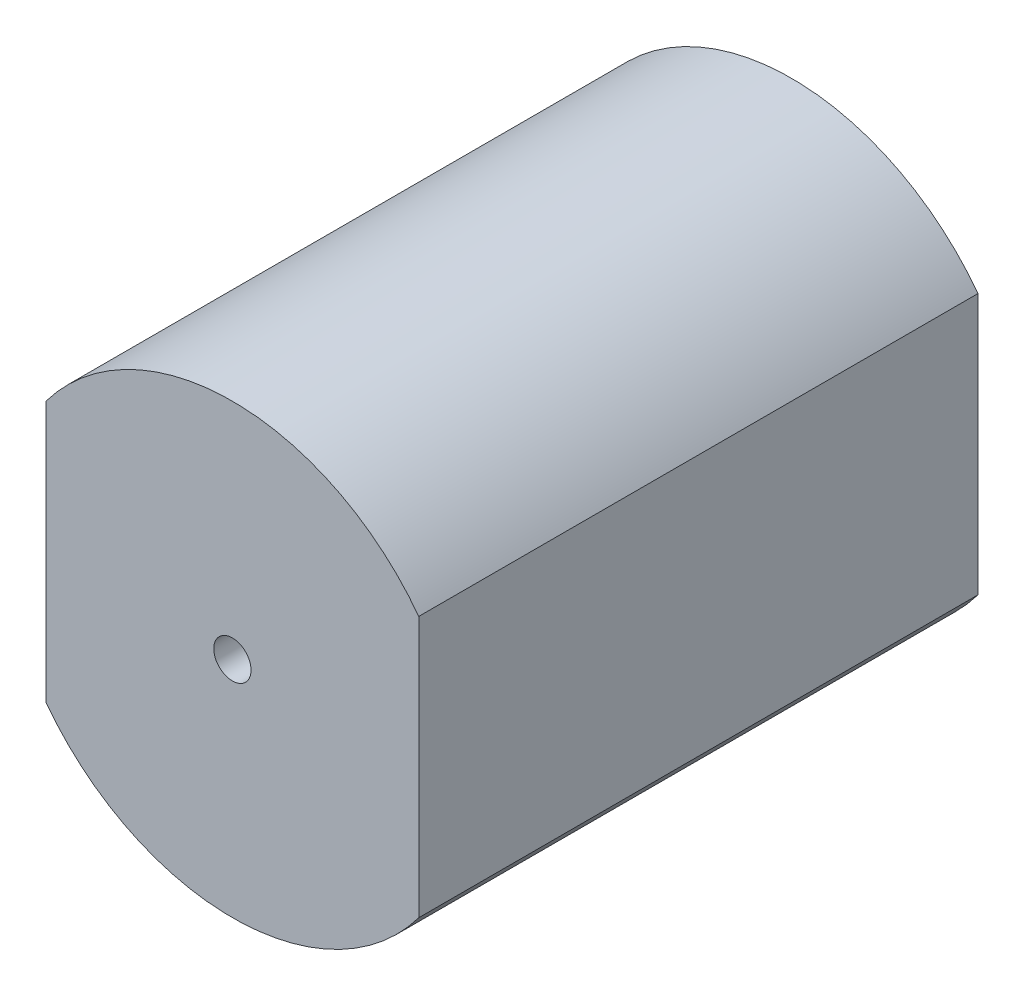
ISO-10303-21;
HEADER;
FILE_DESCRIPTION(('STEP AP214'),'2;1');
FILE_NAME('part.step','',(''),(''),'','','');
FILE_SCHEMA(('AUTOMOTIVE_DESIGN { 1 0 10303 214 1 1 1 1 }'));
ENDSEC;
DATA;
#1=APPLICATION_CONTEXT('core data for automotive mechanical design processes');
#2=APPLICATION_PROTOCOL_DEFINITION('international standard','automotive_design',2000,#1);
#3=PRODUCT_CONTEXT('',#1,'mechanical');
#4=PRODUCT('Part','Part','',(#3));
#5=PRODUCT_RELATED_PRODUCT_CATEGORY('part','',(#4));
#6=PRODUCT_DEFINITION_FORMATION('','',#4);
#7=PRODUCT_DEFINITION_CONTEXT('part definition',#1,'design');
#8=PRODUCT_DEFINITION('design','',#6,#7);
#9=PRODUCT_DEFINITION_SHAPE('','',#8);
#10=(LENGTH_UNIT() NAMED_UNIT(*) SI_UNIT(.MILLI.,.METRE.));
#11=(NAMED_UNIT(*) PLANE_ANGLE_UNIT() SI_UNIT($,.RADIAN.));
#12=(NAMED_UNIT(*) SI_UNIT($,.STERADIAN.) SOLID_ANGLE_UNIT());
#13=UNCERTAINTY_MEASURE_WITH_UNIT(LENGTH_MEASURE(1.E-05),#10,'distance_accuracy_value','');
#14=(GEOMETRIC_REPRESENTATION_CONTEXT(3) GLOBAL_UNCERTAINTY_ASSIGNED_CONTEXT((#13)) GLOBAL_UNIT_ASSIGNED_CONTEXT((#10,
#11,#12)) REPRESENTATION_CONTEXT('',''));
#15=CARTESIAN_POINT('',(0.,0.,0.));
#16=DIRECTION('',(0.,0.,1.));
#17=DIRECTION('',(1.,0.,0.));
#18=AXIS2_PLACEMENT_3D('',#15,#16,#17);
#19=CARTESIAN_POINT('',(5.,6.25,-15.));
#20=DIRECTION('',(0.,0.,1.));
#21=DIRECTION('',(1.,0.,0.));
#22=AXIS2_PLACEMENT_3D('',#19,#20,#21);
#23=PLANE('',#22);
#24=CARTESIAN_POINT('',(5.,6.,-15.));
#25=DIRECTION('',(0.,0.,1.));
#26=DIRECTION('',(1.,0.,0.));
#27=AXIS2_PLACEMENT_3D('',#24,#25,#26);
#28=CIRCLE('',#27,2.6);
#29=CARTESIAN_POINT('',(7.6,6.,-15.));
#30=VERTEX_POINT('',#29);
#31=EDGE_CURVE('E11',#30,#30,#28,.T.);
#32=ORIENTED_EDGE('',*,*,#31,.T.);
#33=EDGE_LOOP('',(#32));
#34=FACE_BOUND('',#33,.T.);
#35=CARTESIAN_POINT('',(5.,6.25,-15.));
#36=DIRECTION('',(0.,0.,1.));
#37=DIRECTION('',(1.,0.,0.));
#38=AXIS2_PLACEMENT_3D('',#35,#36,#37);
#39=CIRCLE('',#38,6.25);
#40=CARTESIAN_POINT('',(0.,2.5,-15.));
#41=VERTEX_POINT('',#40);
#42=CARTESIAN_POINT('',(10.,2.5,-15.));
#43=VERTEX_POINT('',#42);
#44=EDGE_CURVE('E95',#41,#43,#39,.T.);
#45=ORIENTED_EDGE('',*,*,#44,.F.);
#46=DIRECTION('',(0.,-1.,0.));
#47=VECTOR('',#46,1.);
#48=CARTESIAN_POINT('',(0.,2.5,-15.));
#49=LINE('',#48,#47);
#50=CARTESIAN_POINT('',(0.,9.5,-15.));
#51=VERTEX_POINT('',#50);
#52=EDGE_CURVE('E92',#51,#41,#49,.T.);
#53=ORIENTED_EDGE('',*,*,#52,.F.);
#54=CARTESIAN_POINT('',(5.,5.75,-15.));
#55=DIRECTION('',(0.,0.,1.));
#56=DIRECTION('',(-1.,0.,0.));
#57=AXIS2_PLACEMENT_3D('',#54,#55,#56);
#58=CIRCLE('',#57,6.25);
#59=CARTESIAN_POINT('',(10.,9.5,-15.));
#60=VERTEX_POINT('',#59);
#61=EDGE_CURVE('E85',#60,#51,#58,.T.);
#62=ORIENTED_EDGE('',*,*,#61,.F.);
#63=DIRECTION('',(0.,1.,0.));
#64=VECTOR('',#63,1.);
#65=CARTESIAN_POINT('',(10.,2.5,-15.));
#66=LINE('',#65,#64);
#67=EDGE_CURVE('E91',#43,#60,#66,.T.);
#68=ORIENTED_EDGE('',*,*,#67,.F.);
#69=EDGE_LOOP('',(#45,#53,#62,#68));
#70=FACE_BOUND('',#69,.T.);
#71=ADVANCED_FACE('F34',(#34,#70),#23,.F.);
#72=CARTESIAN_POINT('',(5.,6.25,-15.));
#73=DIRECTION('',(0.,0.,1.));
#74=DIRECTION('',(1.,0.,0.));
#75=AXIS2_PLACEMENT_3D('',#72,#73,#74);
#76=CYLINDRICAL_SURFACE('',#75,6.25);
#77=CARTESIAN_POINT('',(5.,6.25,0.));
#78=DIRECTION('',(0.,0.,1.));
#79=DIRECTION('',(1.,0.,0.));
#80=AXIS2_PLACEMENT_3D('',#77,#78,#79);
#81=CIRCLE('',#80,6.25);
#82=CARTESIAN_POINT('',(0.,2.5,0.));
#83=VERTEX_POINT('',#82);
#84=CARTESIAN_POINT('',(10.,2.5,0.));
#85=VERTEX_POINT('',#84);
#86=EDGE_CURVE('E102',#83,#85,#81,.T.);
#87=ORIENTED_EDGE('',*,*,#86,.F.);
#88=DIRECTION('',(0.,0.,1.));
#89=VECTOR('',#88,1.);
#90=CARTESIAN_POINT('',(0.,2.5,-15.));
#91=LINE('',#90,#89);
#92=EDGE_CURVE('E51',#41,#83,#91,.T.);
#93=ORIENTED_EDGE('',*,*,#92,.F.);
#94=ORIENTED_EDGE('',*,*,#44,.T.);
#95=DIRECTION('',(0.,0.,1.));
#96=VECTOR('',#95,1.);
#97=CARTESIAN_POINT('',(10.,2.5,-15.));
#98=LINE('',#97,#96);
#99=EDGE_CURVE('E79',#43,#85,#98,.T.);
#100=ORIENTED_EDGE('',*,*,#99,.T.);
#101=EDGE_LOOP('',(#87,#93,#94,#100));
#102=FACE_BOUND('',#101,.T.);
#103=ADVANCED_FACE('F151',(#102),#76,.T.);
#104=CARTESIAN_POINT('',(0.,2.5,-15.));
#105=DIRECTION('',(-1.,0.,0.));
#106=DIRECTION('',(0.,0.,1.));
#107=AXIS2_PLACEMENT_3D('',#104,#105,#106);
#108=PLANE('',#107);
#109=DIRECTION('',(0.,-1.,0.));
#110=VECTOR('',#109,1.);
#111=CARTESIAN_POINT('',(0.,2.5,0.));
#112=LINE('',#111,#110);
#113=CARTESIAN_POINT('',(0.,9.5,0.));
#114=VERTEX_POINT('',#113);
#115=EDGE_CURVE('E97',#114,#83,#112,.T.);
#116=ORIENTED_EDGE('',*,*,#115,.F.);
#117=DIRECTION('',(0.,0.,1.));
#118=VECTOR('',#117,1.);
#119=CARTESIAN_POINT('',(0.,9.5,-15.));
#120=LINE('',#119,#118);
#121=EDGE_CURVE('E68',#51,#114,#120,.T.);
#122=ORIENTED_EDGE('',*,*,#121,.F.);
#123=ORIENTED_EDGE('',*,*,#52,.T.);
#124=ORIENTED_EDGE('',*,*,#92,.T.);
#125=EDGE_LOOP('',(#116,#122,#123,#124));
#126=FACE_BOUND('',#125,.T.);
#127=ADVANCED_FACE('F157',(#126),#108,.T.);
#128=CARTESIAN_POINT('',(5.,5.75,-15.));
#129=DIRECTION('',(0.,0.,1.));
#130=DIRECTION('',(1.,0.,0.));
#131=AXIS2_PLACEMENT_3D('',#128,#129,#130);
#132=CYLINDRICAL_SURFACE('',#131,6.25);
#133=CARTESIAN_POINT('',(5.,5.75,0.));
#134=DIRECTION('',(0.,0.,1.));
#135=DIRECTION('',(-1.,0.,0.));
#136=AXIS2_PLACEMENT_3D('',#133,#134,#135);
#137=CIRCLE('',#136,6.25);
#138=CARTESIAN_POINT('',(10.,9.5,0.));
#139=VERTEX_POINT('',#138);
#140=EDGE_CURVE('E87',#139,#114,#137,.T.);
#141=ORIENTED_EDGE('',*,*,#140,.F.);
#142=DIRECTION('',(0.,0.,1.));
#143=VECTOR('',#142,1.);
#144=CARTESIAN_POINT('',(10.,9.5,-15.));
#145=LINE('',#144,#143);
#146=EDGE_CURVE('E82',#60,#139,#145,.T.);
#147=ORIENTED_EDGE('',*,*,#146,.F.);
#148=ORIENTED_EDGE('',*,*,#61,.T.);
#149=ORIENTED_EDGE('',*,*,#121,.T.);
#150=EDGE_LOOP('',(#141,#147,#148,#149));
#151=FACE_BOUND('',#150,.T.);
#152=ADVANCED_FACE('F84',(#151),#132,.T.);
#153=CARTESIAN_POINT('',(10.,2.5,-15.));
#154=DIRECTION('',(1.,0.,0.));
#155=DIRECTION('',(0.,0.,-1.));
#156=AXIS2_PLACEMENT_3D('',#153,#154,#155);
#157=PLANE('',#156);
#158=DIRECTION('',(0.,1.,0.));
#159=VECTOR('',#158,1.);
#160=CARTESIAN_POINT('',(10.,2.5,0.));
#161=LINE('',#160,#159);
#162=EDGE_CURVE('E105',#85,#139,#161,.T.);
#163=ORIENTED_EDGE('',*,*,#162,.F.);
#164=ORIENTED_EDGE('',*,*,#99,.F.);
#165=ORIENTED_EDGE('',*,*,#67,.T.);
#166=ORIENTED_EDGE('',*,*,#146,.T.);
#167=EDGE_LOOP('',(#163,#164,#165,#166));
#168=FACE_BOUND('',#167,.T.);
#169=ADVANCED_FACE('F94',(#168),#157,.T.);
#170=CARTESIAN_POINT('',(5.,6.25,0.));
#171=DIRECTION('',(0.,0.,1.));
#172=DIRECTION('',(1.,0.,0.));
#173=AXIS2_PLACEMENT_3D('',#170,#171,#172);
#174=PLANE('',#173);
#175=CARTESIAN_POINT('',(5.,6.,0.));
#176=DIRECTION('',(0.,0.,-1.));
#177=DIRECTION('',(-1.,0.,0.));
#178=AXIS2_PLACEMENT_3D('',#175,#176,#177);
#179=CIRCLE('',#178,0.5);
#180=CARTESIAN_POINT('',(4.5,6.,0.));
#181=VERTEX_POINT('',#180);
#182=EDGE_CURVE('E106',#181,#181,#179,.T.);
#183=ORIENTED_EDGE('',*,*,#182,.T.);
#184=EDGE_LOOP('',(#183));
#185=FACE_BOUND('',#184,.T.);
#186=ORIENTED_EDGE('',*,*,#86,.T.);
#187=ORIENTED_EDGE('',*,*,#162,.T.);
#188=ORIENTED_EDGE('',*,*,#140,.T.);
#189=ORIENTED_EDGE('',*,*,#115,.T.);
#190=EDGE_LOOP('',(#186,#187,#188,#189));
#191=FACE_BOUND('',#190,.T.);
#192=ADVANCED_FACE('F143',(#185,#191),#174,.T.);
#193=CARTESIAN_POINT('',(5.,6.,-17.));
#194=DIRECTION('',(0.,0.,1.));
#195=DIRECTION('',(1.,0.,0.));
#196=AXIS2_PLACEMENT_3D('',#193,#194,#195);
#197=CYLINDRICAL_SURFACE('',#196,2.5);
#198=CARTESIAN_POINT('',(5.,6.,-16.9));
#199=DIRECTION('',(0.,0.,-1.));
#200=DIRECTION('',(-1.,0.,0.));
#201=AXIS2_PLACEMENT_3D('',#198,#199,#200);
#202=CIRCLE('',#201,2.5);
#203=CARTESIAN_POINT('',(2.5,6.,-16.9));
#204=VERTEX_POINT('',#203);
#205=EDGE_CURVE('E43',#204,#204,#202,.F.);
#206=ORIENTED_EDGE('',*,*,#205,.T.);
#207=EDGE_LOOP('',(#206));
#208=FACE_BOUND('',#207,.T.);
#209=CARTESIAN_POINT('',(5.,6.,-15.1));
#210=DIRECTION('',(0.,0.,1.));
#211=DIRECTION('',(1.,0.,0.));
#212=AXIS2_PLACEMENT_3D('',#209,#210,#211);
#213=CIRCLE('',#212,2.5);
#214=CARTESIAN_POINT('',(7.5,6.,-15.1));
#215=VERTEX_POINT('',#214);
#216=EDGE_CURVE('E117',#215,#215,#213,.F.);
#217=ORIENTED_EDGE('',*,*,#216,.T.);
#218=EDGE_LOOP('',(#217));
#219=FACE_BOUND('',#218,.T.);
#220=ADVANCED_FACE('F122',(#208,#219),#197,.T.);
#221=CARTESIAN_POINT('',(5.,6.,-17.));
#222=DIRECTION('',(0.,0.,-1.));
#223=DIRECTION('',(-1.,0.,0.));
#224=AXIS2_PLACEMENT_3D('',#221,#222,#223);
#225=PLANE('',#224);
#226=CARTESIAN_POINT('',(5.,6.,-17.));
#227=DIRECTION('',(0.,0.,-1.));
#228=DIRECTION('',(-1.,0.,0.));
#229=AXIS2_PLACEMENT_3D('',#226,#227,#228);
#230=CIRCLE('',#229,2.4);
#231=CARTESIAN_POINT('',(2.6,6.,-17.));
#232=VERTEX_POINT('',#231);
#233=EDGE_CURVE('E112',#232,#232,#230,.T.);
#234=ORIENTED_EDGE('',*,*,#233,.T.);
#235=EDGE_LOOP('',(#234));
#236=FACE_BOUND('',#235,.T.);
#237=CARTESIAN_POINT('',(5.,6.,-17.));
#238=DIRECTION('',(0.,0.,-1.));
#239=DIRECTION('',(-1.,0.,0.));
#240=AXIS2_PLACEMENT_3D('',#237,#238,#239);
#241=CIRCLE('',#240,0.5);
#242=CARTESIAN_POINT('',(4.5,6.,-17.));
#243=VERTEX_POINT('',#242);
#244=EDGE_CURVE('E137',#243,#243,#241,.T.);
#245=ORIENTED_EDGE('',*,*,#244,.F.);
#246=EDGE_LOOP('',(#245));
#247=FACE_BOUND('',#246,.T.);
#248=ADVANCED_FACE('F131',(#236,#247),#225,.T.);
#249=CARTESIAN_POINT('',(5.,6.,0.));
#250=DIRECTION('',(0.,0.,-1.));
#251=DIRECTION('',(-1.,0.,0.));
#252=AXIS2_PLACEMENT_3D('',#249,#250,#251);
#253=CYLINDRICAL_SURFACE('',#252,0.5);
#254=ORIENTED_EDGE('',*,*,#182,.F.);
#255=EDGE_LOOP('',(#254));
#256=FACE_BOUND('',#255,.T.);
#257=ORIENTED_EDGE('',*,*,#244,.T.);
#258=EDGE_LOOP('',(#257));
#259=FACE_BOUND('',#258,.T.);
#260=ADVANCED_FACE('F128',(#256,#259),#253,.F.);
#261=CARTESIAN_POINT('',(5.,6.,-16.9));
#262=DIRECTION('',(0.,0.,-1.));
#263=DIRECTION('',(-1.,0.,0.));
#264=AXIS2_PLACEMENT_3D('',#261,#262,#263);
#265=TOROIDAL_SURFACE('',#264,2.4,0.1);
#266=ORIENTED_EDGE('',*,*,#205,.F.);
#267=EDGE_LOOP('',(#266));
#268=FACE_BOUND('',#267,.T.);
#269=ORIENTED_EDGE('',*,*,#233,.F.);
#270=EDGE_LOOP('',(#269));
#271=FACE_BOUND('',#270,.T.);
#272=ADVANCED_FACE('F125',(#268,#271),#265,.T.);
#273=CARTESIAN_POINT('',(5.,6.,-15.1));
#274=DIRECTION('',(0.,0.,1.));
#275=DIRECTION('',(1.,0.,0.));
#276=AXIS2_PLACEMENT_3D('',#273,#274,#275);
#277=TOROIDAL_SURFACE('',#276,2.6,0.1);
#278=ORIENTED_EDGE('',*,*,#31,.F.);
#279=EDGE_LOOP('',(#278));
#280=FACE_BOUND('',#279,.T.);
#281=ORIENTED_EDGE('',*,*,#216,.F.);
#282=EDGE_LOOP('',(#281));
#283=FACE_BOUND('',#282,.T.);
#284=ADVANCED_FACE('F36',(#280,#283),#277,.F.);
#285=CLOSED_SHELL('',(#71,#103,#127,#152,#169,#192,#220,#248,#260,#272,#284));
#286=MANIFOLD_SOLID_BREP('B2',#285);
#287=ADVANCED_BREP_SHAPE_REPRESENTATION('',(#18,#286),#14);
#288=SHAPE_DEFINITION_REPRESENTATION(#9,#287);
ENDSEC;
END-ISO-10303-21;
